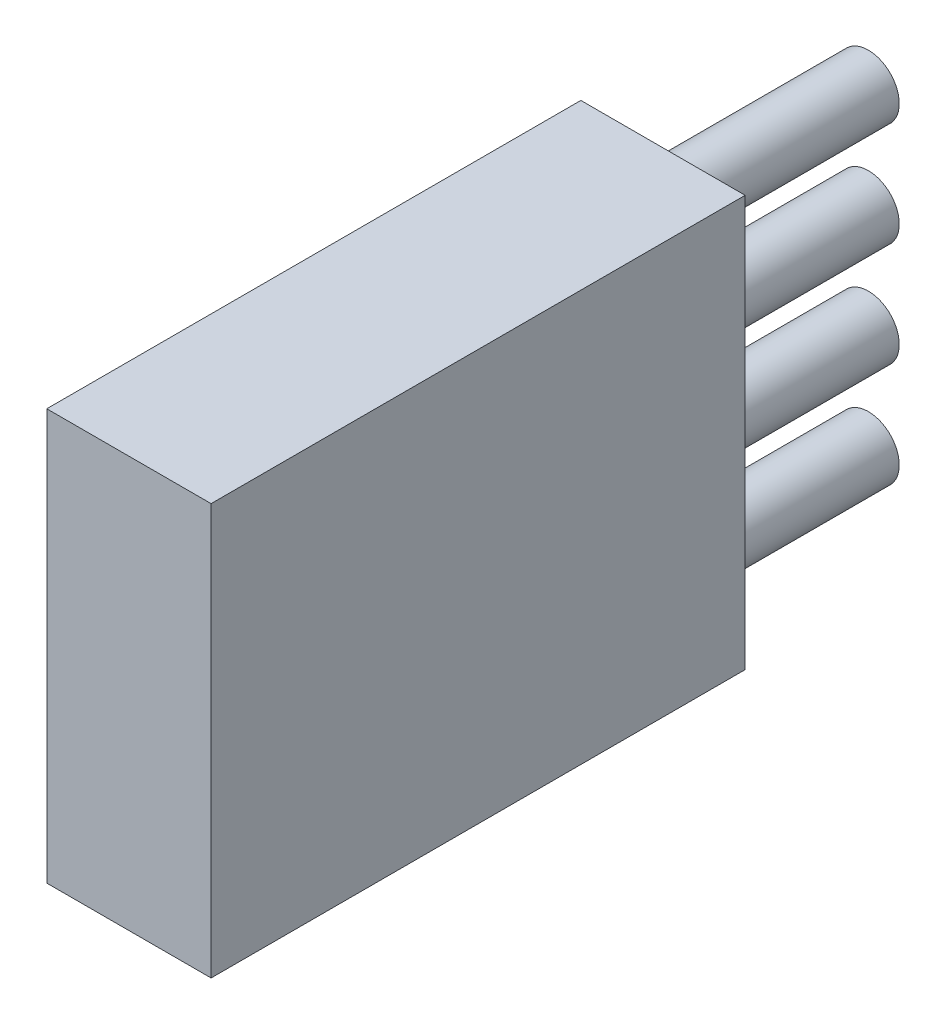
ISO-10303-21;
HEADER;
FILE_DESCRIPTION(('STEP AP214'),'2;1');
FILE_NAME('part.step','',(''),(''),'','','');
FILE_SCHEMA(('AUTOMOTIVE_DESIGN { 1 0 10303 214 1 1 1 1 }'));
ENDSEC;
DATA;
#1=APPLICATION_CONTEXT('core data for automotive mechanical design processes');
#2=APPLICATION_PROTOCOL_DEFINITION('international standard','automotive_design',2000,#1);
#3=PRODUCT_CONTEXT('',#1,'mechanical');
#4=PRODUCT('Part','Part','',(#3));
#5=PRODUCT_RELATED_PRODUCT_CATEGORY('part','',(#4));
#6=PRODUCT_DEFINITION_FORMATION('','',#4);
#7=PRODUCT_DEFINITION_CONTEXT('part definition',#1,'design');
#8=PRODUCT_DEFINITION('design','',#6,#7);
#9=PRODUCT_DEFINITION_SHAPE('','',#8);
#10=(LENGTH_UNIT() NAMED_UNIT(*) SI_UNIT(.MILLI.,.METRE.));
#11=(NAMED_UNIT(*) PLANE_ANGLE_UNIT() SI_UNIT($,.RADIAN.));
#12=(NAMED_UNIT(*) SI_UNIT($,.STERADIAN.) SOLID_ANGLE_UNIT());
#13=UNCERTAINTY_MEASURE_WITH_UNIT(LENGTH_MEASURE(1.E-05),#10,'distance_accuracy_value','');
#14=(GEOMETRIC_REPRESENTATION_CONTEXT(3) GLOBAL_UNCERTAINTY_ASSIGNED_CONTEXT((#13)) GLOBAL_UNIT_ASSIGNED_CONTEXT((#10,
#11,#12)) REPRESENTATION_CONTEXT('',''));
#15=CARTESIAN_POINT('',(0.,0.,0.));
#16=DIRECTION('',(0.,0.,1.));
#17=DIRECTION('',(1.,0.,0.));
#18=AXIS2_PLACEMENT_3D('',#15,#16,#17);
#19=CARTESIAN_POINT('',(0.000117798968651606,3.76009305502237,-4.98730343183408));
#20=DIRECTION('',(-8.74227765734756E-08,0.,-0.999999999999996));
#21=DIRECTION('',(-0.999999999999996,0.,8.74227765734756E-08));
#22=AXIS2_PLACEMENT_3D('',#19,#20,#21);
#23=PLANE('',#22);
#24=CARTESIAN_POINT('',(0.000117798968651606,3.76009305502237,-4.98730343183408));
#25=DIRECTION('',(8.74227765734756E-08,0.,0.999999999999996));
#26=DIRECTION('',(0.999999999999996,0.,-8.74227765734756E-08));
#27=AXIS2_PLACEMENT_3D('',#24,#25,#26);
#28=CIRCLE('',#27,0.75);
#29=CARTESIAN_POINT('',(0.750117798968649,3.76009305502237,-4.98730349740116));
#30=VERTEX_POINT('',#29);
#31=EDGE_CURVE('E113',#30,#30,#28,.T.);
#32=ORIENTED_EDGE('',*,*,#31,.F.);
#33=EDGE_LOOP('',(#32));
#34=FACE_BOUND('',#33,.T.);
#35=ADVANCED_FACE('F17',(#34),#23,.T.);
#36=CARTESIAN_POINT('',(0.000117909995577925,1.22009305502237,-4.98730343183408));
#37=DIRECTION('',(-8.74227765734756E-08,0.,-0.999999999999996));
#38=DIRECTION('',(-0.999999999999996,0.,8.74227765734756E-08));
#39=AXIS2_PLACEMENT_3D('',#36,#37,#38);
#40=PLANE('',#39);
#41=CARTESIAN_POINT('',(0.000117909995577925,1.22009305502237,-4.98730343183408));
#42=DIRECTION('',(8.74227765734756E-08,0.,0.999999999999996));
#43=DIRECTION('',(0.999999999999996,0.,-8.74227765734756E-08));
#44=AXIS2_PLACEMENT_3D('',#41,#42,#43);
#45=CIRCLE('',#44,0.75);
#46=CARTESIAN_POINT('',(0.750117909995575,1.22009305502237,-4.98730349740116));
#47=VERTEX_POINT('',#46);
#48=EDGE_CURVE('E108',#47,#47,#45,.T.);
#49=ORIENTED_EDGE('',*,*,#48,.F.);
#50=EDGE_LOOP('',(#49));
#51=FACE_BOUND('',#50,.T.);
#52=ADVANCED_FACE('F122',(#51),#40,.T.);
#53=CARTESIAN_POINT('',(0.000118021022504244,-1.31990694497763,-4.98730343183408));
#54=DIRECTION('',(-8.74227765734756E-08,0.,-0.999999999999996));
#55=DIRECTION('',(-0.999999999999996,0.,8.74227765734756E-08));
#56=AXIS2_PLACEMENT_3D('',#53,#54,#55);
#57=PLANE('',#56);
#58=CARTESIAN_POINT('',(0.000118021022504244,-1.31990694497763,-4.98730343183408));
#59=DIRECTION('',(8.74227765734756E-08,0.,0.999999999999996));
#60=DIRECTION('',(0.999999999999996,0.,-8.74227765734756E-08));
#61=AXIS2_PLACEMENT_3D('',#58,#59,#60);
#62=CIRCLE('',#61,0.75);
#63=CARTESIAN_POINT('',(0.750118021022502,-1.31990694497763,-4.98730349740116));
#64=VERTEX_POINT('',#63);
#65=EDGE_CURVE('E103',#64,#64,#62,.T.);
#66=ORIENTED_EDGE('',*,*,#65,.F.);
#67=EDGE_LOOP('',(#66));
#68=FACE_BOUND('',#67,.T.);
#69=ADVANCED_FACE('F127',(#68),#57,.T.);
#70=CARTESIAN_POINT('',(0.000118132049430564,-3.85990694497763,-4.98730343183408));
#71=DIRECTION('',(-8.74227765734756E-08,0.,-0.999999999999996));
#72=DIRECTION('',(-0.999999999999996,0.,8.74227765734756E-08));
#73=AXIS2_PLACEMENT_3D('',#70,#71,#72);
#74=PLANE('',#73);
#75=CARTESIAN_POINT('',(0.000118132049430564,-3.85990694497763,-4.98730343183408));
#76=DIRECTION('',(8.74227765734756E-08,0.,0.999999999999996));
#77=DIRECTION('',(0.999999999999996,0.,-8.74227765734756E-08));
#78=AXIS2_PLACEMENT_3D('',#75,#76,#77);
#79=CIRCLE('',#78,0.75);
#80=CARTESIAN_POINT('',(0.750118132049428,-3.85990694497763,-4.98730349740116));
#81=VERTEX_POINT('',#80);
#82=EDGE_CURVE('E66',#81,#81,#79,.T.);
#83=ORIENTED_EDGE('',*,*,#82,.F.);
#84=EDGE_LOOP('',(#83));
#85=FACE_BOUND('',#84,.T.);
#86=ADVANCED_FACE('F165',(#85),#74,.T.);
#87=CARTESIAN_POINT('',(0.000117798968651606,3.76009305502237,-4.98730343183408));
#88=DIRECTION('',(8.74227765734756E-08,0.,0.999999999999996));
#89=DIRECTION('',(0.999999999999996,0.,-8.74227765734756E-08));
#90=AXIS2_PLACEMENT_3D('',#87,#88,#89);
#91=CYLINDRICAL_SURFACE('',#90,0.75);
#92=ORIENTED_EDGE('',*,*,#31,.T.);
#93=EDGE_LOOP('',(#92));
#94=FACE_BOUND('',#93,.T.);
#95=CARTESIAN_POINT('',(0.000118236082534473,3.76009305502239,0.0126965681659218));
#96=DIRECTION('',(8.74227765734756E-08,0.,0.999999999999996));
#97=DIRECTION('',(0.999999999999996,0.,-8.74227765734756E-08));
#98=AXIS2_PLACEMENT_3D('',#95,#96,#97);
#99=CIRCLE('',#98,0.75);
#100=CARTESIAN_POINT('',(0.750118236082532,3.76009305502239,0.0126965025988394));
#101=VERTEX_POINT('',#100);
#102=EDGE_CURVE('E65',#101,#101,#99,.F.);
#103=ORIENTED_EDGE('',*,*,#102,.T.);
#104=EDGE_LOOP('',(#103));
#105=FACE_BOUND('',#104,.T.);
#106=ADVANCED_FACE('F118',(#94,#105),#91,.T.);
#107=CARTESIAN_POINT('',(0.000117909995577925,1.22009305502237,-4.98730343183408));
#108=DIRECTION('',(8.74227765734756E-08,0.,0.999999999999996));
#109=DIRECTION('',(0.999999999999996,0.,-8.74227765734756E-08));
#110=AXIS2_PLACEMENT_3D('',#107,#108,#109);
#111=CYLINDRICAL_SURFACE('',#110,0.75);
#112=ORIENTED_EDGE('',*,*,#48,.T.);
#113=EDGE_LOOP('',(#112));
#114=FACE_BOUND('',#113,.T.);
#115=CARTESIAN_POINT('',(0.000118347109460792,1.22009305502239,0.0126965681659218));
#116=DIRECTION('',(8.74227765734756E-08,0.,0.999999999999996));
#117=DIRECTION('',(0.999999999999996,0.,-8.74227765734756E-08));
#118=AXIS2_PLACEMENT_3D('',#115,#116,#117);
#119=CIRCLE('',#118,0.75);
#120=CARTESIAN_POINT('',(0.750118347109458,1.22009305502239,0.0126965025988394));
#121=VERTEX_POINT('',#120);
#122=EDGE_CURVE('E90',#121,#121,#119,.F.);
#123=ORIENTED_EDGE('',*,*,#122,.T.);
#124=EDGE_LOOP('',(#123));
#125=FACE_BOUND('',#124,.T.);
#126=ADVANCED_FACE('F158',(#114,#125),#111,.T.);
#127=CARTESIAN_POINT('',(0.000118021022504244,-1.31990694497763,-4.98730343183408));
#128=DIRECTION('',(8.74227765734756E-08,0.,0.999999999999996));
#129=DIRECTION('',(0.999999999999996,0.,-8.74227765734756E-08));
#130=AXIS2_PLACEMENT_3D('',#127,#128,#129);
#131=CYLINDRICAL_SURFACE('',#130,0.75);
#132=ORIENTED_EDGE('',*,*,#65,.T.);
#133=EDGE_LOOP('',(#132));
#134=FACE_BOUND('',#133,.T.);
#135=CARTESIAN_POINT('',(0.000118458136387111,-1.31990694497761,0.0126965681659218));
#136=DIRECTION('',(8.74227765734756E-08,0.,0.999999999999996));
#137=DIRECTION('',(0.999999999999996,0.,-8.74227765734756E-08));
#138=AXIS2_PLACEMENT_3D('',#135,#136,#137);
#139=CIRCLE('',#138,0.75);
#140=CARTESIAN_POINT('',(0.750118458136384,-1.31990694497761,0.0126965025988394));
#141=VERTEX_POINT('',#140);
#142=EDGE_CURVE('E82',#141,#141,#139,.F.);
#143=ORIENTED_EDGE('',*,*,#142,.T.);
#144=EDGE_LOOP('',(#143));
#145=FACE_BOUND('',#144,.T.);
#146=ADVANCED_FACE('F154',(#134,#145),#131,.T.);
#147=CARTESIAN_POINT('',(0.000118132049430564,-3.85990694497763,-4.98730343183408));
#148=DIRECTION('',(8.74227765734756E-08,0.,0.999999999999996));
#149=DIRECTION('',(0.999999999999996,0.,-8.74227765734756E-08));
#150=AXIS2_PLACEMENT_3D('',#147,#148,#149);
#151=CYLINDRICAL_SURFACE('',#150,0.75);
#152=ORIENTED_EDGE('',*,*,#82,.T.);
#153=EDGE_LOOP('',(#152));
#154=FACE_BOUND('',#153,.T.);
#155=CARTESIAN_POINT('',(0.000118569163313431,-3.85990694497761,0.0126965681659218));
#156=DIRECTION('',(8.74227765734756E-08,0.,0.999999999999996));
#157=DIRECTION('',(0.999999999999996,0.,-8.74227765734756E-08));
#158=AXIS2_PLACEMENT_3D('',#155,#156,#157);
#159=CIRCLE('',#158,0.75);
#160=CARTESIAN_POINT('',(0.750118569163311,-3.85990694497761,0.0126965025988394));
#161=VERTEX_POINT('',#160);
#162=EDGE_CURVE('E79',#161,#161,#159,.F.);
#163=ORIENTED_EDGE('',*,*,#162,.T.);
#164=EDGE_LOOP('',(#163));
#165=FACE_BOUND('',#164,.T.);
#166=ADVANCED_FACE('F151',(#154,#165),#151,.T.);
#167=CARTESIAN_POINT('',(-1.99988102912903,-0.0499070324003696,6.51269674301147));
#168=DIRECTION('',(-0.999999999999995,-4.37113882867377E-08,8.74227765734755E-08));
#169=DIRECTION('',(8.74227765734756E-08,0.,0.999999999999996));
#170=AXIS2_PLACEMENT_3D('',#167,#168,#169);
#171=PLANE('',#170);
#172=DIRECTION('',(0.,0.,1.));
#173=VECTOR('',#172,1.);
#174=CARTESIAN_POINT('',(-1.99988137882013,-5.04990703240039,0.0126963933203692));
#175=LINE('',#174,#173);
#176=CARTESIAN_POINT('',(-1.99988159737708,-5.04990703240039,0.0126966555887076));
#177=VERTEX_POINT('',#176);
#178=CARTESIAN_POINT('',(-1.99988081057209,-5.04990698868899,13.0126967430115));
#179=VERTEX_POINT('',#178);
#180=EDGE_CURVE('E55',#177,#179,#175,.T.);
#181=ORIENTED_EDGE('',*,*,#180,.T.);
#182=DIRECTION('',(0.,1.,0.));
#183=VECTOR('',#182,1.);
#184=CARTESIAN_POINT('',(-1.99988024232404,-5.04990685755479,13.0126967430115));
#185=LINE('',#184,#183);
#186=CARTESIAN_POINT('',(-1.99988046088098,4.95009296759966,13.0126966555887));
#187=VERTEX_POINT('',#186);
#188=EDGE_CURVE('E311',#179,#187,#185,.T.);
#189=ORIENTED_EDGE('',*,*,#188,.T.);
#190=DIRECTION('',(0.,0.,1.));
#191=VECTOR('',#190,1.);
#192=CARTESIAN_POINT('',(-1.99988067943792,4.95009296759966,0.0126963933203692));
#193=LINE('',#192,#191);
#194=CARTESIAN_POINT('',(-1.99988153181,4.95009305502241,0.0126967430114751));
#195=VERTEX_POINT('',#194);
#196=EDGE_CURVE('E60',#187,#195,#193,.F.);
#197=ORIENTED_EDGE('',*,*,#196,.T.);
#198=DIRECTION('',(0.,1.,0.));
#199=VECTOR('',#198,1.);
#200=CARTESIAN_POINT('',(-1.99988181593402,-5.04990685755484,0.0126967430115137));
#201=LINE('',#200,#199);
#202=EDGE_CURVE('E58',#195,#177,#201,.F.);
#203=ORIENTED_EDGE('',*,*,#202,.T.);
#204=EDGE_LOOP('',(#181,#189,#197,#203));
#205=FACE_BOUND('',#204,.T.);
#206=ADVANCED_FACE('F59',(#205),#171,.T.);
#207=CARTESIAN_POINT('',(2.00011862117987,-5.04990685755484,0.0126963933203692));
#208=DIRECTION('',(8.74227765734756E-08,0.,0.999999999999996));
#209=DIRECTION('',(0.999999999999996,0.,-8.74227765734756E-08));
#210=AXIS2_PLACEMENT_3D('',#207,#208,#209);
#211=PLANE('',#210);
#212=ORIENTED_EDGE('',*,*,#162,.F.);
#213=EDGE_LOOP('',(#212));
#214=FACE_BOUND('',#213,.T.);
#215=ORIENTED_EDGE('',*,*,#142,.F.);
#216=EDGE_LOOP('',(#215));
#217=FACE_BOUND('',#216,.T.);
#218=ORIENTED_EDGE('',*,*,#122,.F.);
#219=EDGE_LOOP('',(#218));
#220=FACE_BOUND('',#219,.T.);
#221=ORIENTED_EDGE('',*,*,#102,.F.);
#222=EDGE_LOOP('',(#221));
#223=FACE_BOUND('',#222,.T.);
#224=DIRECTION('',(0.999999999999999,4.37113882867379E-08,0.));
#225=VECTOR('',#224,1.);
#226=CARTESIAN_POINT('',(2.00011818406598,4.95009314244516,0.0126967430114755));
#227=LINE('',#226,#225);
#228=CARTESIAN_POINT('',(2.00011840262292,4.95009314244517,0.0126964807431256));
#229=VERTEX_POINT('',#228);
#230=EDGE_CURVE('E319',#195,#229,#227,.T.);
#231=ORIENTED_EDGE('',*,*,#230,.T.);
#232=DIRECTION('',(-4.37113882867375E-08,0.999999999999999,0.));
#233=VECTOR('',#232,1.);
#234=CARTESIAN_POINT('',(2.00011840262292,-0.0499068575548165,0.0126963933203472));
#235=LINE('',#234,#233);
#236=CARTESIAN_POINT('',(2.00011890530389,-5.0499069449776,0.0126963933203586));
#237=VERTEX_POINT('',#236);
#238=EDGE_CURVE('E78',#229,#237,#235,.F.);
#239=ORIENTED_EDGE('',*,*,#238,.T.);
#240=DIRECTION('',(-0.999999999999999,-4.37113882867379E-08,0.));
#241=VECTOR('',#240,1.);
#242=CARTESIAN_POINT('',(2.00011862117987,-5.04990685755484,0.0126963933203692));
#243=LINE('',#242,#241);
#244=EDGE_CURVE('E72',#237,#177,#243,.T.);
#245=ORIENTED_EDGE('',*,*,#244,.T.);
#246=ORIENTED_EDGE('',*,*,#202,.F.);
#247=EDGE_LOOP('',(#231,#239,#245,#246));
#248=FACE_BOUND('',#247,.T.);
#249=ADVANCED_FACE('F77',(#214,#217,#220,#223,#248),#211,.F.);
#250=CARTESIAN_POINT('',(2.00011862117987,-5.04990685755484,0.0126963933203692));
#251=DIRECTION('',(-4.37113882867379E-08,0.999999999999999,0.));
#252=DIRECTION('',(-0.999999999999999,-4.37113882867379E-08,0.));
#253=AXIS2_PLACEMENT_3D('',#250,#251,#252);
#254=PLANE('',#253);
#255=ORIENTED_EDGE('',*,*,#244,.F.);
#256=DIRECTION('',(8.74227765734756E-08,0.,0.999999999999996));
#257=VECTOR('',#256,1.);
#258=CARTESIAN_POINT('',(2.00011918942791,-5.04990685755484,6.51269639332035));
#259=LINE('',#258,#257);
#260=CARTESIAN_POINT('',(2.00011964839749,-5.0499068575548,13.012696568166));
#261=VERTEX_POINT('',#260);
#262=EDGE_CURVE('E312',#237,#261,#259,.T.);
#263=ORIENTED_EDGE('',*,*,#262,.T.);
#264=DIRECTION('',(-0.999999999999996,0.,8.74227765734756E-08));
#265=VECTOR('',#264,1.);
#266=CARTESIAN_POINT('',(2.00011975767596,-5.04990685755479,13.0126963933204));
#267=LINE('',#266,#265);
#268=EDGE_CURVE('E74',#261,#179,#267,.T.);
#269=ORIENTED_EDGE('',*,*,#268,.T.);
#270=ORIENTED_EDGE('',*,*,#180,.F.);
#271=EDGE_LOOP('',(#255,#263,#269,#270));
#272=FACE_BOUND('',#271,.T.);
#273=ADVANCED_FACE('F70',(#272),#254,.F.);
#274=CARTESIAN_POINT('',(2.00011975767596,-5.04990685755479,13.0126963933204));
#275=DIRECTION('',(-8.74227765734756E-08,0.,-0.999999999999996));
#276=DIRECTION('',(-0.999999999999996,0.,8.74227765734756E-08));
#277=AXIS2_PLACEMENT_3D('',#274,#275,#276);
#278=PLANE('',#277);
#279=ORIENTED_EDGE('',*,*,#268,.F.);
#280=DIRECTION('',(-4.37113882867375E-08,0.999999999999999,0.));
#281=VECTOR('',#280,1.);
#282=CARTESIAN_POINT('',(2.00011953911902,-0.0499068575548165,13.0126963933204));
#283=LINE('',#282,#281);
#284=CARTESIAN_POINT('',(2.00011903643805,4.95009305502242,13.0126963933204));
#285=VERTEX_POINT('',#284);
#286=EDGE_CURVE('E26',#261,#285,#283,.T.);
#287=ORIENTED_EDGE('',*,*,#286,.T.);
#288=DIRECTION('',(0.999999999999999,4.37113882867379E-08,0.));
#289=VECTOR('',#288,1.);
#290=CARTESIAN_POINT('',(2.00011818406598,4.95009314244516,13.0126963933204));
#291=LINE('',#290,#289);
#292=EDGE_CURVE('E34',#285,#187,#291,.F.);
#293=ORIENTED_EDGE('',*,*,#292,.T.);
#294=ORIENTED_EDGE('',*,*,#188,.F.);
#295=EDGE_LOOP('',(#279,#287,#293,#294));
#296=FACE_BOUND('',#295,.T.);
#297=ADVANCED_FACE('F137',(#296),#278,.F.);
#298=CARTESIAN_POINT('',(2.00011818406598,4.95009314244516,0.0126963933203692));
#299=DIRECTION('',(4.37113882867379E-08,-0.999999999999999,0.));
#300=DIRECTION('',(0.999999999999999,4.37113882867379E-08,0.));
#301=AXIS2_PLACEMENT_3D('',#298,#299,#300);
#302=PLANE('',#301);
#303=ORIENTED_EDGE('',*,*,#292,.F.);
#304=DIRECTION('',(8.74227765734756E-08,0.,0.999999999999996));
#305=VECTOR('',#304,1.);
#306=CARTESIAN_POINT('',(2.00011875231403,4.95009314244521,6.51269639332039));
#307=LINE('',#306,#305);
#308=EDGE_CURVE('E11',#285,#229,#307,.F.);
#309=ORIENTED_EDGE('',*,*,#308,.T.);
#310=ORIENTED_EDGE('',*,*,#230,.F.);
#311=ORIENTED_EDGE('',*,*,#196,.F.);
#312=EDGE_LOOP('',(#303,#309,#310,#311));
#313=FACE_BOUND('',#312,.T.);
#314=ADVANCED_FACE('F131',(#313),#302,.F.);
#315=CARTESIAN_POINT('',(2.00011897087097,-0.0499068575548165,6.51269639332037));
#316=DIRECTION('',(-0.999999999999995,-4.37113882867377E-08,8.74227765734755E-08));
#317=DIRECTION('',(8.74227765734756E-08,0.,0.999999999999996));
#318=AXIS2_PLACEMENT_3D('',#315,#316,#317);
#319=PLANE('',#318);
#320=ORIENTED_EDGE('',*,*,#286,.F.);
#321=ORIENTED_EDGE('',*,*,#262,.F.);
#322=ORIENTED_EDGE('',*,*,#238,.F.);
#323=ORIENTED_EDGE('',*,*,#308,.F.);
#324=EDGE_LOOP('',(#320,#321,#322,#323));
#325=FACE_BOUND('',#324,.T.);
#326=ADVANCED_FACE('F129',(#325),#319,.F.);
#327=CLOSED_SHELL('',(#35,#52,#69,#86,#106,#126,#146,#166,#206,#249,#273,#297,#314,#326));
#328=MANIFOLD_SOLID_BREP('B1',#327);
#329=ADVANCED_BREP_SHAPE_REPRESENTATION('',(#18,#328),#14);
#330=SHAPE_DEFINITION_REPRESENTATION(#9,#329);
ENDSEC;
END-ISO-10303-21;
